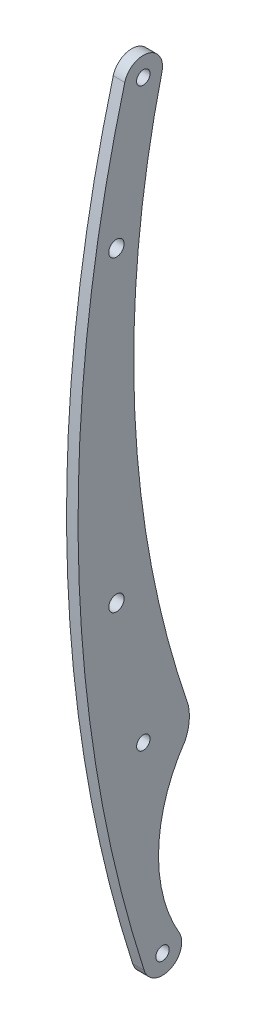
ISO-10303-21;
HEADER;
FILE_DESCRIPTION(('STEP AP214'),'2;1');
FILE_NAME('part.step','',(''),(''),'','','');
FILE_SCHEMA(('AUTOMOTIVE_DESIGN { 1 0 10303 214 1 1 1 1 }'));
ENDSEC;
DATA;
#1=APPLICATION_CONTEXT('core data for automotive mechanical design processes');
#2=APPLICATION_PROTOCOL_DEFINITION('international standard','automotive_design',2000,#1);
#3=PRODUCT_CONTEXT('',#1,'mechanical');
#4=PRODUCT('Part','Part','',(#3));
#5=PRODUCT_RELATED_PRODUCT_CATEGORY('part','',(#4));
#6=PRODUCT_DEFINITION_FORMATION('','',#4);
#7=PRODUCT_DEFINITION_CONTEXT('part definition',#1,'design');
#8=PRODUCT_DEFINITION('design','',#6,#7);
#9=PRODUCT_DEFINITION_SHAPE('','',#8);
#10=(LENGTH_UNIT() NAMED_UNIT(*) SI_UNIT(.MILLI.,.METRE.));
#11=(NAMED_UNIT(*) PLANE_ANGLE_UNIT() SI_UNIT($,.RADIAN.));
#12=(NAMED_UNIT(*) SI_UNIT($,.STERADIAN.) SOLID_ANGLE_UNIT());
#13=UNCERTAINTY_MEASURE_WITH_UNIT(LENGTH_MEASURE(1.E-05),#10,'distance_accuracy_value','');
#14=(GEOMETRIC_REPRESENTATION_CONTEXT(3) GLOBAL_UNCERTAINTY_ASSIGNED_CONTEXT((#13)) GLOBAL_UNIT_ASSIGNED_CONTEXT((#10,
#11,#12)) REPRESENTATION_CONTEXT('',''));
#15=CARTESIAN_POINT('',(0.,0.,0.));
#16=DIRECTION('',(0.,0.,1.));
#17=DIRECTION('',(1.,0.,0.));
#18=AXIS2_PLACEMENT_3D('',#15,#16,#17);
#19=CARTESIAN_POINT('',(3.,4.25655617686929,-174.004482003241));
#20=DIRECTION('',(1.,0.,0.));
#21=DIRECTION('',(0.,0.,-1.));
#22=AXIS2_PLACEMENT_3D('',#19,#20,#21);
#23=PLANE('',#22);
#24=CARTESIAN_POINT('',(3.,35.,7.));
#25=DIRECTION('',(1.,0.,0.));
#26=DIRECTION('',(0.,0.,-1.));
#27=AXIS2_PLACEMENT_3D('',#24,#25,#26);
#28=CIRCLE('',#27,2.);
#29=CARTESIAN_POINT('',(3.,35.,5.00000000000001));
#30=VERTEX_POINT('',#29);
#31=EDGE_CURVE('E193',#30,#30,#28,.T.);
#32=ORIENTED_EDGE('',*,*,#31,.F.);
#33=EDGE_LOOP('',(#32));
#34=FACE_BOUND('',#33,.T.);
#35=CARTESIAN_POINT('',(3.,150.,0.));
#36=DIRECTION('',(1.,0.,0.));
#37=DIRECTION('',(0.,0.,-1.));
#38=AXIS2_PLACEMENT_3D('',#35,#36,#37);
#39=CIRCLE('',#38,1.75);
#40=CARTESIAN_POINT('',(3.,150.,-1.75));
#41=VERTEX_POINT('',#40);
#42=EDGE_CURVE('E205',#41,#41,#39,.T.);
#43=ORIENTED_EDGE('',*,*,#42,.F.);
#44=EDGE_LOOP('',(#43));
#45=FACE_BOUND('',#44,.T.);
#46=CARTESIAN_POINT('',(3.,58.5131123537386,-343.008964006482));
#47=DIRECTION('',(1.,0.,0.));
#48=DIRECTION('',(0.,0.,-1.));
#49=AXIS2_PLACEMENT_3D('',#46,#47,#48);
#50=CIRCLE('',#49,360.);
#51=CARTESIAN_POINT('',(3.,151.288547713328,4.83111216910528));
#52=VERTEX_POINT('',#51);
#53=CARTESIAN_POINT('',(3.,-51.4834424039355,-0.22512841699319));
#54=VERTEX_POINT('',#53);
#55=EDGE_CURVE('E128',#52,#54,#50,.T.);
#56=ORIENTED_EDGE('',*,*,#55,.T.);
#57=CARTESIAN_POINT('',(3.,-50.,-5.00000000000001));
#58=DIRECTION('',(1.,0.,0.));
#59=DIRECTION('',(0.,0.,-1.));
#60=AXIS2_PLACEMENT_3D('',#57,#58,#59);
#61=CIRCLE('',#60,5.);
#62=CARTESIAN_POINT('',(3.,-47.7156331601391,-9.44765872577291));
#63=VERTEX_POINT('',#62);
#64=EDGE_CURVE('E86',#54,#63,#61,.T.);
#65=ORIENTED_EDGE('',*,*,#64,.T.);
#66=CARTESIAN_POINT('',(3.,-27.4896601498018,-43.9572228462469));
#67=DIRECTION('',(-1.,0.,0.));
#68=DIRECTION('',(0.,0.,-1.));
#69=AXIS2_PLACEMENT_3D('',#66,#67,#68);
#70=CIRCLE('',#69,40.);
#71=CARTESIAN_POINT('',(3.,-4.86872902149104,-10.967929509041));
#72=VERTEX_POINT('',#71);
#73=EDGE_CURVE('E99',#63,#72,#70,.T.);
#74=ORIENTED_EDGE('',*,*,#73,.T.);
#75=CARTESIAN_POINT('',(3.,0.,0.));
#76=DIRECTION('',(1.,0.,0.));
#77=DIRECTION('',(0.,0.,-1.));
#78=AXIS2_PLACEMENT_3D('',#75,#76,#77);
#79=CIRCLE('',#78,12.);
#80=CARTESIAN_POINT('',(3.,2.69820884063807,-11.692718633932));
#81=VERTEX_POINT('',#80);
#82=EDGE_CURVE('E93',#72,#81,#79,.T.);
#83=ORIENTED_EDGE('',*,*,#82,.T.);
#84=CARTESIAN_POINT('',(3.,87.415217224807,-257.503679517365));
#85=DIRECTION('',(-1.,0.,0.));
#86=DIRECTION('',(0.,0.,-1.));
#87=AXIS2_PLACEMENT_3D('',#84,#85,#86);
#88=CIRCLE('',#87,260.);
#89=CARTESIAN_POINT('',(3.,148.819155041978,-4.85855999089357));
#90=VERTEX_POINT('',#89);
#91=EDGE_CURVE('E97',#81,#90,#88,.T.);
#92=ORIENTED_EDGE('',*,*,#91,.T.);
#93=CARTESIAN_POINT('',(3.,150.,0.));
#94=DIRECTION('',(1.,0.,0.));
#95=DIRECTION('',(0.,0.,-1.));
#96=AXIS2_PLACEMENT_3D('',#93,#94,#95);
#97=CIRCLE('',#96,4.99999999999989);
#98=EDGE_CURVE('E49',#90,#52,#97,.T.);
#99=ORIENTED_EDGE('',*,*,#98,.T.);
#100=EDGE_LOOP('',(#56,#65,#74,#83,#92,#99));
#101=FACE_BOUND('',#100,.T.);
#102=CARTESIAN_POINT('',(3.,-50.,-5.00000000000001));
#103=DIRECTION('',(1.,0.,0.));
#104=DIRECTION('',(0.,0.,-1.));
#105=AXIS2_PLACEMENT_3D('',#102,#103,#104);
#106=CIRCLE('',#105,1.75);
#107=CARTESIAN_POINT('',(3.,-50.,-6.75000000000001));
#108=VERTEX_POINT('',#107);
#109=EDGE_CURVE('E121',#108,#108,#106,.T.);
#110=ORIENTED_EDGE('',*,*,#109,.F.);
#111=EDGE_LOOP('',(#110));
#112=FACE_BOUND('',#111,.T.);
#113=CARTESIAN_POINT('',(3.,0.,0.));
#114=DIRECTION('',(1.,0.,0.));
#115=DIRECTION('',(0.,0.,-1.));
#116=AXIS2_PLACEMENT_3D('',#113,#114,#115);
#117=CIRCLE('',#116,1.75);
#118=CARTESIAN_POINT('',(3.,0.,-1.75));
#119=VERTEX_POINT('',#118);
#120=EDGE_CURVE('E199',#119,#119,#117,.T.);
#121=ORIENTED_EDGE('',*,*,#120,.F.);
#122=EDGE_LOOP('',(#121));
#123=FACE_BOUND('',#122,.T.);
#124=CARTESIAN_POINT('',(3.,115.,7.));
#125=DIRECTION('',(1.,0.,0.));
#126=DIRECTION('',(0.,0.,-1.));
#127=AXIS2_PLACEMENT_3D('',#124,#125,#126);
#128=CIRCLE('',#127,2.00000000000001);
#129=CARTESIAN_POINT('',(3.,115.,5.));
#130=VERTEX_POINT('',#129);
#131=EDGE_CURVE('E184',#130,#130,#128,.T.);
#132=ORIENTED_EDGE('',*,*,#131,.F.);
#133=EDGE_LOOP('',(#132));
#134=FACE_BOUND('',#133,.T.);
#135=ADVANCED_FACE('F32',(#34,#45,#101,#112,#123,#134),#23,.T.);
#136=CARTESIAN_POINT('',(0.,4.25655617686929,-174.004482003241));
#137=DIRECTION('',(1.,0.,0.));
#138=DIRECTION('',(0.,0.,-1.));
#139=AXIS2_PLACEMENT_3D('',#136,#137,#138);
#140=PLANE('',#139);
#141=CARTESIAN_POINT('',(0.,35.,7.));
#142=DIRECTION('',(1.,0.,0.));
#143=DIRECTION('',(0.,0.,-1.));
#144=AXIS2_PLACEMENT_3D('',#141,#142,#143);
#145=CIRCLE('',#144,2.);
#146=CARTESIAN_POINT('',(0.,35.,5.00000000000001));
#147=VERTEX_POINT('',#146);
#148=EDGE_CURVE('E190',#147,#147,#145,.T.);
#149=ORIENTED_EDGE('',*,*,#148,.T.);
#150=EDGE_LOOP('',(#149));
#151=FACE_BOUND('',#150,.T.);
#152=CARTESIAN_POINT('',(0.,150.,0.));
#153=DIRECTION('',(1.,0.,0.));
#154=DIRECTION('',(0.,0.,-1.));
#155=AXIS2_PLACEMENT_3D('',#152,#153,#154);
#156=CIRCLE('',#155,1.75);
#157=CARTESIAN_POINT('',(0.,150.,-1.75));
#158=VERTEX_POINT('',#157);
#159=EDGE_CURVE('E202',#158,#158,#156,.T.);
#160=ORIENTED_EDGE('',*,*,#159,.T.);
#161=EDGE_LOOP('',(#160));
#162=FACE_BOUND('',#161,.T.);
#163=CARTESIAN_POINT('',(0.,58.5131123537386,-343.008964006482));
#164=DIRECTION('',(1.,0.,0.));
#165=DIRECTION('',(0.,0.,-1.));
#166=AXIS2_PLACEMENT_3D('',#163,#164,#165);
#167=CIRCLE('',#166,360.);
#168=CARTESIAN_POINT('',(0.,151.288547713328,4.83111216910528));
#169=VERTEX_POINT('',#168);
#170=CARTESIAN_POINT('',(0.,-51.4834424039355,-0.22512841699319));
#171=VERTEX_POINT('',#170);
#172=EDGE_CURVE('E117',#169,#171,#167,.T.);
#173=ORIENTED_EDGE('',*,*,#172,.F.);
#174=CARTESIAN_POINT('',(0.,150.,0.));
#175=DIRECTION('',(1.,0.,0.));
#176=DIRECTION('',(0.,0.,-1.));
#177=AXIS2_PLACEMENT_3D('',#174,#175,#176);
#178=CIRCLE('',#177,4.99999999999989);
#179=CARTESIAN_POINT('',(0.,148.819155041978,-4.85855999089357));
#180=VERTEX_POINT('',#179);
#181=EDGE_CURVE('E78',#180,#169,#178,.T.);
#182=ORIENTED_EDGE('',*,*,#181,.F.);
#183=CARTESIAN_POINT('',(0.,87.415217224807,-257.503679517365));
#184=DIRECTION('',(-1.,0.,0.));
#185=DIRECTION('',(0.,0.,-1.));
#186=AXIS2_PLACEMENT_3D('',#183,#184,#185);
#187=CIRCLE('',#186,260.);
#188=CARTESIAN_POINT('',(0.,2.69820884063807,-11.692718633932));
#189=VERTEX_POINT('',#188);
#190=EDGE_CURVE('E72',#189,#180,#187,.T.);
#191=ORIENTED_EDGE('',*,*,#190,.F.);
#192=CARTESIAN_POINT('',(0.,0.,0.));
#193=DIRECTION('',(1.,0.,0.));
#194=DIRECTION('',(0.,0.,-1.));
#195=AXIS2_PLACEMENT_3D('',#192,#193,#194);
#196=CIRCLE('',#195,12.);
#197=CARTESIAN_POINT('',(0.,-4.86872902149104,-10.967929509041));
#198=VERTEX_POINT('',#197);
#199=EDGE_CURVE('E107',#198,#189,#196,.T.);
#200=ORIENTED_EDGE('',*,*,#199,.F.);
#201=CARTESIAN_POINT('',(0.,-27.4896601498018,-43.9572228462469));
#202=DIRECTION('',(-1.,0.,0.));
#203=DIRECTION('',(0.,0.,-1.));
#204=AXIS2_PLACEMENT_3D('',#201,#202,#203);
#205=CIRCLE('',#204,40.);
#206=CARTESIAN_POINT('',(0.,-47.7156331601391,-9.44765872577291));
#207=VERTEX_POINT('',#206);
#208=EDGE_CURVE('E123',#207,#198,#205,.T.);
#209=ORIENTED_EDGE('',*,*,#208,.F.);
#210=CARTESIAN_POINT('',(0.,-50.,-5.00000000000001));
#211=DIRECTION('',(1.,0.,0.));
#212=DIRECTION('',(0.,0.,-1.));
#213=AXIS2_PLACEMENT_3D('',#210,#211,#212);
#214=CIRCLE('',#213,5.);
#215=EDGE_CURVE('E120',#171,#207,#214,.T.);
#216=ORIENTED_EDGE('',*,*,#215,.F.);
#217=EDGE_LOOP('',(#173,#182,#191,#200,#209,#216));
#218=FACE_BOUND('',#217,.T.);
#219=CARTESIAN_POINT('',(0.,-50.,-5.00000000000001));
#220=DIRECTION('',(1.,0.,0.));
#221=DIRECTION('',(0.,0.,-1.));
#222=AXIS2_PLACEMENT_3D('',#219,#220,#221);
#223=CIRCLE('',#222,1.75);
#224=CARTESIAN_POINT('',(0.,-50.,-6.75000000000001));
#225=VERTEX_POINT('',#224);
#226=EDGE_CURVE('E208',#225,#225,#223,.T.);
#227=ORIENTED_EDGE('',*,*,#226,.T.);
#228=EDGE_LOOP('',(#227));
#229=FACE_BOUND('',#228,.T.);
#230=CARTESIAN_POINT('',(0.,0.,0.));
#231=DIRECTION('',(1.,0.,0.));
#232=DIRECTION('',(0.,0.,-1.));
#233=AXIS2_PLACEMENT_3D('',#230,#231,#232);
#234=CIRCLE('',#233,1.75);
#235=CARTESIAN_POINT('',(0.,0.,-1.75));
#236=VERTEX_POINT('',#235);
#237=EDGE_CURVE('E196',#236,#236,#234,.T.);
#238=ORIENTED_EDGE('',*,*,#237,.T.);
#239=EDGE_LOOP('',(#238));
#240=FACE_BOUND('',#239,.T.);
#241=CARTESIAN_POINT('',(0.,115.,7.));
#242=DIRECTION('',(1.,0.,0.));
#243=DIRECTION('',(0.,0.,-1.));
#244=AXIS2_PLACEMENT_3D('',#241,#242,#243);
#245=CIRCLE('',#244,2.00000000000001);
#246=CARTESIAN_POINT('',(0.,115.,5.));
#247=VERTEX_POINT('',#246);
#248=EDGE_CURVE('E187',#247,#247,#245,.T.);
#249=ORIENTED_EDGE('',*,*,#248,.T.);
#250=EDGE_LOOP('',(#249));
#251=FACE_BOUND('',#250,.T.);
#252=ADVANCED_FACE('F137',(#151,#162,#218,#229,#240,#251),#140,.F.);
#253=CARTESIAN_POINT('',(3.,58.5131123537386,-343.008964006482));
#254=DIRECTION('',(-1.,0.,0.));
#255=DIRECTION('',(0.,0.,1.));
#256=AXIS2_PLACEMENT_3D('',#253,#254,#255);
#257=CYLINDRICAL_SURFACE('',#256,360.);
#258=ORIENTED_EDGE('',*,*,#172,.T.);
#259=DIRECTION('',(-1.,0.,0.));
#260=VECTOR('',#259,1.);
#261=CARTESIAN_POINT('',(3.,-51.4834424039355,-0.22512841699319));
#262=LINE('',#261,#260);
#263=EDGE_CURVE('E11',#54,#171,#262,.T.);
#264=ORIENTED_EDGE('',*,*,#263,.F.);
#265=ORIENTED_EDGE('',*,*,#55,.F.);
#266=DIRECTION('',(-1.,0.,0.));
#267=VECTOR('',#266,1.);
#268=CARTESIAN_POINT('',(3.,151.288547713328,4.83111216910528));
#269=LINE('',#268,#267);
#270=EDGE_CURVE('E113',#52,#169,#269,.T.);
#271=ORIENTED_EDGE('',*,*,#270,.T.);
#272=EDGE_LOOP('',(#258,#264,#265,#271));
#273=FACE_BOUND('',#272,.T.);
#274=ADVANCED_FACE('F34',(#273),#257,.T.);
#275=CARTESIAN_POINT('',(3.,-50.,-5.00000000000001));
#276=DIRECTION('',(-1.,0.,0.));
#277=DIRECTION('',(0.,0.,1.));
#278=AXIS2_PLACEMENT_3D('',#275,#276,#277);
#279=CYLINDRICAL_SURFACE('',#278,5.);
#280=ORIENTED_EDGE('',*,*,#215,.T.);
#281=DIRECTION('',(-1.,0.,0.));
#282=VECTOR('',#281,1.);
#283=CARTESIAN_POINT('',(3.,-47.7156331601391,-9.44765872577291));
#284=LINE('',#283,#282);
#285=EDGE_CURVE('E41',#63,#207,#284,.T.);
#286=ORIENTED_EDGE('',*,*,#285,.F.);
#287=ORIENTED_EDGE('',*,*,#64,.F.);
#288=ORIENTED_EDGE('',*,*,#263,.T.);
#289=EDGE_LOOP('',(#280,#286,#287,#288));
#290=FACE_BOUND('',#289,.T.);
#291=ADVANCED_FACE('F274',(#290),#279,.T.);
#292=CARTESIAN_POINT('',(3.,-27.4896601498018,-43.9572228462469));
#293=DIRECTION('',(-1.,0.,0.));
#294=DIRECTION('',(0.,0.,1.));
#295=AXIS2_PLACEMENT_3D('',#292,#293,#294);
#296=CYLINDRICAL_SURFACE('',#295,40.);
#297=ORIENTED_EDGE('',*,*,#208,.T.);
#298=DIRECTION('',(-1.,0.,0.));
#299=VECTOR('',#298,1.);
#300=CARTESIAN_POINT('',(3.,-4.86872902149104,-10.967929509041));
#301=LINE('',#300,#299);
#302=EDGE_CURVE('E108',#72,#198,#301,.T.);
#303=ORIENTED_EDGE('',*,*,#302,.F.);
#304=ORIENTED_EDGE('',*,*,#73,.F.);
#305=ORIENTED_EDGE('',*,*,#285,.T.);
#306=EDGE_LOOP('',(#297,#303,#304,#305));
#307=FACE_BOUND('',#306,.T.);
#308=ADVANCED_FACE('F134',(#307),#296,.F.);
#309=CARTESIAN_POINT('',(3.,0.,0.));
#310=DIRECTION('',(-1.,0.,0.));
#311=DIRECTION('',(0.,0.,1.));
#312=AXIS2_PLACEMENT_3D('',#309,#310,#311);
#313=CYLINDRICAL_SURFACE('',#312,12.);
#314=ORIENTED_EDGE('',*,*,#199,.T.);
#315=DIRECTION('',(-1.,0.,0.));
#316=VECTOR('',#315,1.);
#317=CARTESIAN_POINT('',(3.,2.69820884063807,-11.692718633932));
#318=LINE('',#317,#316);
#319=EDGE_CURVE('E104',#81,#189,#318,.T.);
#320=ORIENTED_EDGE('',*,*,#319,.F.);
#321=ORIENTED_EDGE('',*,*,#82,.F.);
#322=ORIENTED_EDGE('',*,*,#302,.T.);
#323=EDGE_LOOP('',(#314,#320,#321,#322));
#324=FACE_BOUND('',#323,.T.);
#325=ADVANCED_FACE('F105',(#324),#313,.T.);
#326=CARTESIAN_POINT('',(3.,87.415217224807,-257.503679517365));
#327=DIRECTION('',(-1.,0.,0.));
#328=DIRECTION('',(0.,0.,1.));
#329=AXIS2_PLACEMENT_3D('',#326,#327,#328);
#330=CYLINDRICAL_SURFACE('',#329,260.);
#331=ORIENTED_EDGE('',*,*,#190,.T.);
#332=DIRECTION('',(-1.,0.,0.));
#333=VECTOR('',#332,1.);
#334=CARTESIAN_POINT('',(3.,148.819155041978,-4.85855999089357));
#335=LINE('',#334,#333);
#336=EDGE_CURVE('E109',#90,#180,#335,.T.);
#337=ORIENTED_EDGE('',*,*,#336,.F.);
#338=ORIENTED_EDGE('',*,*,#91,.F.);
#339=ORIENTED_EDGE('',*,*,#319,.T.);
#340=EDGE_LOOP('',(#331,#337,#338,#339));
#341=FACE_BOUND('',#340,.T.);
#342=ADVANCED_FACE('F111',(#341),#330,.F.);
#343=CARTESIAN_POINT('',(3.,150.,0.));
#344=DIRECTION('',(-1.,0.,0.));
#345=DIRECTION('',(0.,0.,1.));
#346=AXIS2_PLACEMENT_3D('',#343,#344,#345);
#347=CYLINDRICAL_SURFACE('',#346,4.99999999999989);
#348=ORIENTED_EDGE('',*,*,#181,.T.);
#349=ORIENTED_EDGE('',*,*,#270,.F.);
#350=ORIENTED_EDGE('',*,*,#98,.F.);
#351=ORIENTED_EDGE('',*,*,#336,.T.);
#352=EDGE_LOOP('',(#348,#349,#350,#351));
#353=FACE_BOUND('',#352,.T.);
#354=ADVANCED_FACE('F142',(#353),#347,.T.);
#355=CARTESIAN_POINT('',(3.,-50.,-5.00000000000001));
#356=DIRECTION('',(-1.,0.,0.));
#357=DIRECTION('',(0.,0.,1.));
#358=AXIS2_PLACEMENT_3D('',#355,#356,#357);
#359=CYLINDRICAL_SURFACE('',#358,1.75);
#360=ORIENTED_EDGE('',*,*,#109,.T.);
#361=EDGE_LOOP('',(#360));
#362=FACE_BOUND('',#361,.T.);
#363=ORIENTED_EDGE('',*,*,#226,.F.);
#364=EDGE_LOOP('',(#363));
#365=FACE_BOUND('',#364,.T.);
#366=ADVANCED_FACE('F144',(#362,#365),#359,.F.);
#367=CARTESIAN_POINT('',(3.,150.,0.));
#368=DIRECTION('',(-1.,0.,0.));
#369=DIRECTION('',(0.,0.,1.));
#370=AXIS2_PLACEMENT_3D('',#367,#368,#369);
#371=CYLINDRICAL_SURFACE('',#370,1.75);
#372=ORIENTED_EDGE('',*,*,#42,.T.);
#373=EDGE_LOOP('',(#372));
#374=FACE_BOUND('',#373,.T.);
#375=ORIENTED_EDGE('',*,*,#159,.F.);
#376=EDGE_LOOP('',(#375));
#377=FACE_BOUND('',#376,.T.);
#378=ADVANCED_FACE('F150',(#374,#377),#371,.F.);
#379=CARTESIAN_POINT('',(3.,0.,0.));
#380=DIRECTION('',(-1.,0.,0.));
#381=DIRECTION('',(0.,0.,1.));
#382=AXIS2_PLACEMENT_3D('',#379,#380,#381);
#383=CYLINDRICAL_SURFACE('',#382,1.75);
#384=ORIENTED_EDGE('',*,*,#120,.T.);
#385=EDGE_LOOP('',(#384));
#386=FACE_BOUND('',#385,.T.);
#387=ORIENTED_EDGE('',*,*,#237,.F.);
#388=EDGE_LOOP('',(#387));
#389=FACE_BOUND('',#388,.T.);
#390=ADVANCED_FACE('F167',(#386,#389),#383,.F.);
#391=CARTESIAN_POINT('',(3.,35.,7.));
#392=DIRECTION('',(-1.,0.,0.));
#393=DIRECTION('',(0.,0.,1.));
#394=AXIS2_PLACEMENT_3D('',#391,#392,#393);
#395=CYLINDRICAL_SURFACE('',#394,2.);
#396=ORIENTED_EDGE('',*,*,#31,.T.);
#397=EDGE_LOOP('',(#396));
#398=FACE_BOUND('',#397,.T.);
#399=ORIENTED_EDGE('',*,*,#148,.F.);
#400=EDGE_LOOP('',(#399));
#401=FACE_BOUND('',#400,.T.);
#402=ADVANCED_FACE('F171',(#398,#401),#395,.F.);
#403=CARTESIAN_POINT('',(3.,115.,7.));
#404=DIRECTION('',(-1.,0.,0.));
#405=DIRECTION('',(0.,0.,1.));
#406=AXIS2_PLACEMENT_3D('',#403,#404,#405);
#407=CYLINDRICAL_SURFACE('',#406,2.00000000000001);
#408=ORIENTED_EDGE('',*,*,#131,.T.);
#409=EDGE_LOOP('',(#408));
#410=FACE_BOUND('',#409,.T.);
#411=ORIENTED_EDGE('',*,*,#248,.F.);
#412=EDGE_LOOP('',(#411));
#413=FACE_BOUND('',#412,.T.);
#414=ADVANCED_FACE('F175',(#410,#413),#407,.F.);
#415=CLOSED_SHELL('',(#135,#252,#274,#291,#308,#325,#342,#354,#366,#378,#390,#402,#414));
#416=MANIFOLD_SOLID_BREP('B2',#415);
#417=ADVANCED_BREP_SHAPE_REPRESENTATION('',(#18,#416),#14);
#418=SHAPE_DEFINITION_REPRESENTATION(#9,#417);
ENDSEC;
END-ISO-10303-21;
